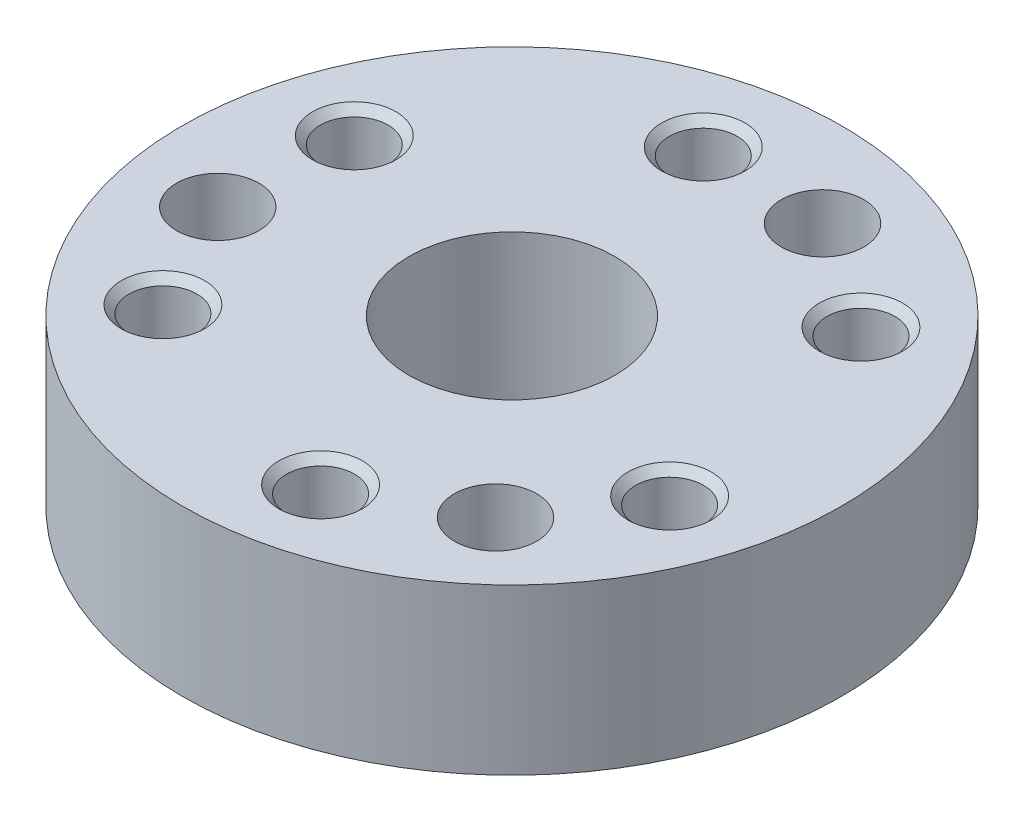
ISO-10303-21;
HEADER;
FILE_DESCRIPTION(('STEP AP214'),'2;1');
FILE_NAME('part.step','',(''),(''),'','','');
FILE_SCHEMA(('AUTOMOTIVE_DESIGN { 1 0 10303 214 1 1 1 1 }'));
ENDSEC;
DATA;
#1=APPLICATION_CONTEXT('core data for automotive mechanical design processes');
#2=APPLICATION_PROTOCOL_DEFINITION('international standard','automotive_design',2000,#1);
#3=PRODUCT_CONTEXT('',#1,'mechanical');
#4=PRODUCT('Part','Part','',(#3));
#5=PRODUCT_RELATED_PRODUCT_CATEGORY('part','',(#4));
#6=PRODUCT_DEFINITION_FORMATION('','',#4);
#7=PRODUCT_DEFINITION_CONTEXT('part definition',#1,'design');
#8=PRODUCT_DEFINITION('design','',#6,#7);
#9=PRODUCT_DEFINITION_SHAPE('','',#8);
#10=(LENGTH_UNIT() NAMED_UNIT(*) SI_UNIT(.MILLI.,.METRE.));
#11=(NAMED_UNIT(*) PLANE_ANGLE_UNIT() SI_UNIT($,.RADIAN.));
#12=(NAMED_UNIT(*) SI_UNIT($,.STERADIAN.) SOLID_ANGLE_UNIT());
#13=UNCERTAINTY_MEASURE_WITH_UNIT(LENGTH_MEASURE(1.E-05),#10,'distance_accuracy_value','');
#14=(GEOMETRIC_REPRESENTATION_CONTEXT(3) GLOBAL_UNCERTAINTY_ASSIGNED_CONTEXT((#13)) GLOBAL_UNIT_ASSIGNED_CONTEXT((#10,
#11,#12)) REPRESENTATION_CONTEXT('',''));
#15=CARTESIAN_POINT('',(0.,0.,0.));
#16=DIRECTION('',(0.,0.,1.));
#17=DIRECTION('',(1.,0.,0.));
#18=AXIS2_PLACEMENT_3D('',#15,#16,#17);
#19=CARTESIAN_POINT('',(0.,8.,0.));
#20=DIRECTION('',(0.,-1.,0.));
#21=DIRECTION('',(0.,0.,-1.));
#22=AXIS2_PLACEMENT_3D('',#19,#20,#21);
#23=CYLINDRICAL_SURFACE('',#22,16.);
#24=CARTESIAN_POINT('',(0.,8.,0.));
#25=DIRECTION('',(0.,1.,0.));
#26=DIRECTION('',(0.,0.,1.));
#27=AXIS2_PLACEMENT_3D('',#24,#25,#26);
#28=CIRCLE('',#27,16.);
#29=CARTESIAN_POINT('',(0.,8.,16.));
#30=VERTEX_POINT('',#29);
#31=EDGE_CURVE('E11',#30,#30,#28,.T.);
#32=ORIENTED_EDGE('',*,*,#31,.F.);
#33=EDGE_LOOP('',(#32));
#34=FACE_BOUND('',#33,.T.);
#35=CARTESIAN_POINT('',(0.,0.,0.));
#36=DIRECTION('',(0.,1.,0.));
#37=DIRECTION('',(0.,0.,1.));
#38=AXIS2_PLACEMENT_3D('',#35,#36,#37);
#39=CIRCLE('',#38,16.);
#40=CARTESIAN_POINT('',(0.,0.,16.));
#41=VERTEX_POINT('',#40);
#42=EDGE_CURVE('E46',#41,#41,#39,.T.);
#43=ORIENTED_EDGE('',*,*,#42,.T.);
#44=EDGE_LOOP('',(#43));
#45=FACE_BOUND('',#44,.T.);
#46=ADVANCED_FACE('F43',(#34,#45),#23,.T.);
#47=CARTESIAN_POINT('',(0.,8.,0.));
#48=DIRECTION('',(0.,1.,0.));
#49=DIRECTION('',(0.,0.,1.));
#50=AXIS2_PLACEMENT_3D('',#47,#48,#49);
#51=PLANE('',#50);
#52=CARTESIAN_POINT('',(0.,8.,0.));
#53=DIRECTION('',(0.,1.,0.));
#54=DIRECTION('',(0.,0.,1.));
#55=AXIS2_PLACEMENT_3D('',#52,#53,#54);
#56=CIRCLE('',#55,5.);
#57=CARTESIAN_POINT('',(0.,8.,5.));
#58=VERTEX_POINT('',#57);
#59=EDGE_CURVE('E447',#58,#58,#56,.T.);
#60=ORIENTED_EDGE('',*,*,#59,.F.);
#61=EDGE_LOOP('',(#60));
#62=FACE_BOUND('',#61,.T.);
#63=CARTESIAN_POINT('',(3.64691287822149,8.,-11.4324112268));
#64=DIRECTION('',(0.,1.,0.));
#65=DIRECTION('',(0.,0.,1.));
#66=AXIS2_PLACEMENT_3D('',#63,#64,#65);
#67=CIRCLE('',#66,2.);
#68=CARTESIAN_POINT('',(3.64691287822149,8.,-9.43241122679998));
#69=VERTEX_POINT('',#68);
#70=EDGE_CURVE('E429',#69,#69,#67,.T.);
#71=ORIENTED_EDGE('',*,*,#70,.F.);
#72=EDGE_LOOP('',(#71));
#73=FACE_BOUND('',#72,.T.);
#74=CARTESIAN_POINT('',(8.07730210980904,8.,8.87452481132831));
#75=DIRECTION('',(0.,1.,0.));
#76=DIRECTION('',(0.,0.,1.));
#77=AXIS2_PLACEMENT_3D('',#74,#75,#76);
#78=CIRCLE('',#77,2.0000000000003);
#79=CARTESIAN_POINT('',(8.07730210980904,8.,10.8745248113286));
#80=VERTEX_POINT('',#79);
#81=EDGE_CURVE('E442',#80,#80,#78,.T.);
#82=ORIENTED_EDGE('',*,*,#81,.F.);
#83=EDGE_LOOP('',(#82));
#84=FACE_BOUND('',#83,.T.);
#85=CARTESIAN_POINT('',(-11.7242149880296,8.,2.557886415472));
#86=DIRECTION('',(0.,1.,0.));
#87=DIRECTION('',(0.,0.,1.));
#88=AXIS2_PLACEMENT_3D('',#85,#86,#87);
#89=CIRCLE('',#88,2.00000000000069);
#90=CARTESIAN_POINT('',(-11.7242149880296,8.,4.5578864154727));
#91=VERTEX_POINT('',#90);
#92=EDGE_CURVE('E435',#91,#91,#89,.T.);
#93=ORIENTED_EDGE('',*,*,#92,.F.);
#94=EDGE_LOOP('',(#93));
#95=FACE_BOUND('',#94,.T.);
#96=CARTESIAN_POINT('',(-11.4005241824297,8.,-3.74540363189675));
#97=DIRECTION('',(0.,1.,0.));
#98=DIRECTION('',(0.,0.,1.));
#99=AXIS2_PLACEMENT_3D('',#96,#97,#98);
#100=CIRCLE('',#99,2.025);
#101=CARTESIAN_POINT('',(-11.4005241824297,8.,-1.72040363189675));
#102=VERTEX_POINT('',#101);
#103=EDGE_CURVE('E86',#102,#102,#100,.T.);
#104=ORIENTED_EDGE('',*,*,#103,.F.);
#105=EDGE_LOOP('',(#104));
#106=FACE_BOUND('',#105,.T.);
#107=CARTESIAN_POINT('',(-2.4566473985656,8.,-11.7458453743918));
#108=DIRECTION('',(0.,1.,0.));
#109=DIRECTION('',(0.,0.,1.));
#110=AXIS2_PLACEMENT_3D('',#107,#108,#109);
#111=CIRCLE('',#110,2.025);
#112=CARTESIAN_POINT('',(-2.4566473985656,8.,-9.72084537439179));
#113=VERTEX_POINT('',#112);
#114=EDGE_CURVE('E79',#113,#113,#111,.T.);
#115=ORIENTED_EDGE('',*,*,#114,.F.);
#116=EDGE_LOOP('',(#115));
#117=FACE_BOUND('',#116,.T.);
#118=CARTESIAN_POINT('',(8.94387678386458,8.,-8.00044174249514));
#119=DIRECTION('',(0.,1.,0.));
#120=DIRECTION('',(0.,0.,1.));
#121=AXIS2_PLACEMENT_3D('',#118,#119,#120);
#122=CIRCLE('',#121,2.025);
#123=CARTESIAN_POINT('',(8.94387678386458,8.,-5.97544174249513));
#124=VERTEX_POINT('',#123);
#125=EDGE_CURVE('E95',#124,#124,#122,.T.);
#126=ORIENTED_EDGE('',*,*,#125,.F.);
#127=EDGE_LOOP('',(#126));
#128=FACE_BOUND('',#127,.T.);
#129=CARTESIAN_POINT('',(11.4005241824307,8.,3.74540363189655));
#130=DIRECTION('',(0.,1.,0.));
#131=DIRECTION('',(0.,0.,1.));
#132=AXIS2_PLACEMENT_3D('',#129,#130,#131);
#133=CIRCLE('',#132,2.025);
#134=CARTESIAN_POINT('',(11.4005241824307,8.,5.77040363189655));
#135=VERTEX_POINT('',#134);
#136=EDGE_CURVE('E104',#135,#135,#133,.T.);
#137=ORIENTED_EDGE('',*,*,#136,.F.);
#138=EDGE_LOOP('',(#137));
#139=FACE_BOUND('',#138,.T.);
#140=CARTESIAN_POINT('',(2.45664739856658,8.,11.7458453743916));
#141=DIRECTION('',(0.,1.,0.));
#142=DIRECTION('',(0.,0.,1.));
#143=AXIS2_PLACEMENT_3D('',#140,#141,#142);
#144=CIRCLE('',#143,2.025);
#145=CARTESIAN_POINT('',(2.45664739856658,8.,13.7708453743916));
#146=VERTEX_POINT('',#145);
#147=EDGE_CURVE('E113',#146,#146,#144,.T.);
#148=ORIENTED_EDGE('',*,*,#147,.F.);
#149=EDGE_LOOP('',(#148));
#150=FACE_BOUND('',#149,.T.);
#151=CARTESIAN_POINT('',(-8.9438767838636,8.,8.00044174249493));
#152=DIRECTION('',(0.,1.,0.));
#153=DIRECTION('',(0.,0.,1.));
#154=AXIS2_PLACEMENT_3D('',#151,#152,#153);
#155=CIRCLE('',#154,2.025);
#156=CARTESIAN_POINT('',(-8.9438767838636,8.,10.0254417424949));
#157=VERTEX_POINT('',#156);
#158=EDGE_CURVE('E122',#157,#157,#155,.T.);
#159=ORIENTED_EDGE('',*,*,#158,.F.);
#160=EDGE_LOOP('',(#159));
#161=FACE_BOUND('',#160,.T.);
#162=ORIENTED_EDGE('',*,*,#31,.T.);
#163=EDGE_LOOP('',(#162));
#164=FACE_BOUND('',#163,.T.);
#165=ADVANCED_FACE('F139',(#62,#73,#84,#95,#106,#117,#128,#139,#150,#161,#164),#51,.T.);
#166=CARTESIAN_POINT('',(0.,0.,0.));
#167=DIRECTION('',(0.,1.,0.));
#168=DIRECTION('',(0.,0.,1.));
#169=AXIS2_PLACEMENT_3D('',#166,#167,#168);
#170=PLANE('',#169);
#171=CARTESIAN_POINT('',(0.,0.,0.));
#172=DIRECTION('',(0.,1.,0.));
#173=DIRECTION('',(0.,0.,1.));
#174=AXIS2_PLACEMENT_3D('',#171,#172,#173);
#175=CIRCLE('',#174,5.);
#176=CARTESIAN_POINT('',(0.,0.,5.));
#177=VERTEX_POINT('',#176);
#178=EDGE_CURVE('E436',#177,#177,#175,.T.);
#179=ORIENTED_EDGE('',*,*,#178,.T.);
#180=EDGE_LOOP('',(#179));
#181=FACE_BOUND('',#180,.T.);
#182=CARTESIAN_POINT('',(3.64691287822149,0.,-11.4324112268));
#183=DIRECTION('',(0.,1.,0.));
#184=DIRECTION('',(0.,0.,1.));
#185=AXIS2_PLACEMENT_3D('',#182,#183,#184);
#186=CIRCLE('',#185,2.);
#187=CARTESIAN_POINT('',(3.64691287822149,0.,-9.43241122679998));
#188=VERTEX_POINT('',#187);
#189=EDGE_CURVE('E427',#188,#188,#186,.T.);
#190=ORIENTED_EDGE('',*,*,#189,.T.);
#191=EDGE_LOOP('',(#190));
#192=FACE_BOUND('',#191,.T.);
#193=CARTESIAN_POINT('',(8.07730210980904,0.,8.87452481132831));
#194=DIRECTION('',(0.,1.,0.));
#195=DIRECTION('',(0.,0.,1.));
#196=AXIS2_PLACEMENT_3D('',#193,#194,#195);
#197=CIRCLE('',#196,2.0000000000003);
#198=CARTESIAN_POINT('',(8.07730210980904,0.,10.8745248113286));
#199=VERTEX_POINT('',#198);
#200=EDGE_CURVE('E439',#199,#199,#197,.T.);
#201=ORIENTED_EDGE('',*,*,#200,.T.);
#202=EDGE_LOOP('',(#201));
#203=FACE_BOUND('',#202,.T.);
#204=CARTESIAN_POINT('',(-11.7242149880296,0.,2.557886415472));
#205=DIRECTION('',(0.,1.,0.));
#206=DIRECTION('',(0.,0.,1.));
#207=AXIS2_PLACEMENT_3D('',#204,#205,#206);
#208=CIRCLE('',#207,2.00000000000069);
#209=CARTESIAN_POINT('',(-11.7242149880296,0.,4.5578864154727));
#210=VERTEX_POINT('',#209);
#211=EDGE_CURVE('E432',#210,#210,#208,.T.);
#212=ORIENTED_EDGE('',*,*,#211,.T.);
#213=EDGE_LOOP('',(#212));
#214=FACE_BOUND('',#213,.T.);
#215=ORIENTED_EDGE('',*,*,#42,.F.);
#216=EDGE_LOOP('',(#215));
#217=FACE_BOUND('',#216,.T.);
#218=ADVANCED_FACE('F136',(#181,#192,#203,#214,#217),#170,.F.);
#219=CARTESIAN_POINT('',(-8.9438767838636,2.,8.00044174249493));
#220=DIRECTION('',(0.,1.,0.));
#221=DIRECTION('',(0.,0.,1.));
#222=AXIS2_PLACEMENT_3D('',#219,#220,#221);
#223=CONICAL_SURFACE('',#222,1.65,1.02974425867665);
#224=CARTESIAN_POINT('',(-8.9438767838636,1.00857997860453,8.00044174249493));
#225=VERTEX_POINT('',#224);
#226=VERTEX_LOOP('',#225);
#227=FACE_BOUND('',#226,.T.);
#228=CARTESIAN_POINT('',(-8.9438767838636,2.,8.00044174249493));
#229=DIRECTION('',(0.,1.,0.));
#230=DIRECTION('',(0.,0.,1.));
#231=AXIS2_PLACEMENT_3D('',#228,#229,#230);
#232=CIRCLE('',#231,1.65);
#233=CARTESIAN_POINT('',(-8.9438767838636,2.,9.65044174249493));
#234=VERTEX_POINT('',#233);
#235=EDGE_CURVE('E128',#234,#234,#232,.T.);
#236=ORIENTED_EDGE('',*,*,#235,.T.);
#237=EDGE_LOOP('',(#236));
#238=FACE_BOUND('',#237,.T.);
#239=ADVANCED_FACE('F138',(#227,#238),#223,.F.);
#240=CARTESIAN_POINT('',(-8.9438767838636,8.,8.00044174249493));
#241=DIRECTION('',(0.,1.,0.));
#242=DIRECTION('',(0.,0.,1.));
#243=AXIS2_PLACEMENT_3D('',#240,#241,#242);
#244=CYLINDRICAL_SURFACE('',#243,1.65);
#245=ORIENTED_EDGE('',*,*,#235,.F.);
#246=EDGE_LOOP('',(#245));
#247=FACE_BOUND('',#246,.T.);
#248=CARTESIAN_POINT('',(-8.9438767838636,7.625,8.00044174249493));
#249=DIRECTION('',(0.,1.,0.));
#250=DIRECTION('',(0.,0.,1.));
#251=AXIS2_PLACEMENT_3D('',#248,#249,#250);
#252=CIRCLE('',#251,1.65);
#253=CARTESIAN_POINT('',(-8.9438767838636,7.625,9.65044174249493));
#254=VERTEX_POINT('',#253);
#255=EDGE_CURVE('E125',#254,#254,#252,.T.);
#256=ORIENTED_EDGE('',*,*,#255,.T.);
#257=EDGE_LOOP('',(#256));
#258=FACE_BOUND('',#257,.T.);
#259=ADVANCED_FACE('F145',(#247,#258),#244,.F.);
#260=CARTESIAN_POINT('',(-8.9438767838636,8.,8.00044174249493));
#261=DIRECTION('',(0.,1.,0.));
#262=DIRECTION('',(0.,0.,1.));
#263=AXIS2_PLACEMENT_3D('',#260,#261,#262);
#264=CONICAL_SURFACE('',#263,2.025,0.785398163397445);
#265=ORIENTED_EDGE('',*,*,#255,.F.);
#266=EDGE_LOOP('',(#265));
#267=FACE_BOUND('',#266,.T.);
#268=ORIENTED_EDGE('',*,*,#158,.T.);
#269=EDGE_LOOP('',(#268));
#270=FACE_BOUND('',#269,.T.);
#271=ADVANCED_FACE('F316',(#267,#270),#264,.F.);
#272=CARTESIAN_POINT('',(2.45664739856658,2.,11.7458453743916));
#273=DIRECTION('',(0.,1.,0.));
#274=DIRECTION('',(0.,0.,1.));
#275=AXIS2_PLACEMENT_3D('',#272,#273,#274);
#276=CONICAL_SURFACE('',#275,1.65,1.02974425867665);
#277=CARTESIAN_POINT('',(2.45664739856658,1.00857997860453,11.7458453743916));
#278=VERTEX_POINT('',#277);
#279=VERTEX_LOOP('',#278);
#280=FACE_BOUND('',#279,.T.);
#281=CARTESIAN_POINT('',(2.45664739856658,2.,11.7458453743916));
#282=DIRECTION('',(0.,1.,0.));
#283=DIRECTION('',(0.,0.,1.));
#284=AXIS2_PLACEMENT_3D('',#281,#282,#283);
#285=CIRCLE('',#284,1.65);
#286=CARTESIAN_POINT('',(2.45664739856658,2.,13.3958453743916));
#287=VERTEX_POINT('',#286);
#288=EDGE_CURVE('E119',#287,#287,#285,.T.);
#289=ORIENTED_EDGE('',*,*,#288,.T.);
#290=EDGE_LOOP('',(#289));
#291=FACE_BOUND('',#290,.T.);
#292=ADVANCED_FACE('F308',(#280,#291),#276,.F.);
#293=CARTESIAN_POINT('',(2.45664739856658,8.,11.7458453743916));
#294=DIRECTION('',(0.,1.,0.));
#295=DIRECTION('',(0.,0.,1.));
#296=AXIS2_PLACEMENT_3D('',#293,#294,#295);
#297=CYLINDRICAL_SURFACE('',#296,1.65);
#298=ORIENTED_EDGE('',*,*,#288,.F.);
#299=EDGE_LOOP('',(#298));
#300=FACE_BOUND('',#299,.T.);
#301=CARTESIAN_POINT('',(2.45664739856658,7.625,11.7458453743916));
#302=DIRECTION('',(0.,1.,0.));
#303=DIRECTION('',(0.,0.,1.));
#304=AXIS2_PLACEMENT_3D('',#301,#302,#303);
#305=CIRCLE('',#304,1.65);
#306=CARTESIAN_POINT('',(2.45664739856658,7.625,13.3958453743916));
#307=VERTEX_POINT('',#306);
#308=EDGE_CURVE('E116',#307,#307,#305,.T.);
#309=ORIENTED_EDGE('',*,*,#308,.T.);
#310=EDGE_LOOP('',(#309));
#311=FACE_BOUND('',#310,.T.);
#312=ADVANCED_FACE('F300',(#300,#311),#297,.F.);
#313=CARTESIAN_POINT('',(2.45664739856658,8.,11.7458453743916));
#314=DIRECTION('',(0.,1.,0.));
#315=DIRECTION('',(0.,0.,1.));
#316=AXIS2_PLACEMENT_3D('',#313,#314,#315);
#317=CONICAL_SURFACE('',#316,2.025,0.785398163397445);
#318=ORIENTED_EDGE('',*,*,#308,.F.);
#319=EDGE_LOOP('',(#318));
#320=FACE_BOUND('',#319,.T.);
#321=ORIENTED_EDGE('',*,*,#147,.T.);
#322=EDGE_LOOP('',(#321));
#323=FACE_BOUND('',#322,.T.);
#324=ADVANCED_FACE('F292',(#320,#323),#317,.F.);
#325=CARTESIAN_POINT('',(11.4005241824307,2.,3.74540363189655));
#326=DIRECTION('',(0.,1.,0.));
#327=DIRECTION('',(0.,0.,1.));
#328=AXIS2_PLACEMENT_3D('',#325,#326,#327);
#329=CONICAL_SURFACE('',#328,1.65,1.02974425867665);
#330=CARTESIAN_POINT('',(11.4005241824307,1.00857997860453,3.74540363189655));
#331=VERTEX_POINT('',#330);
#332=VERTEX_LOOP('',#331);
#333=FACE_BOUND('',#332,.T.);
#334=CARTESIAN_POINT('',(11.4005241824307,2.,3.74540363189655));
#335=DIRECTION('',(0.,1.,0.));
#336=DIRECTION('',(0.,0.,1.));
#337=AXIS2_PLACEMENT_3D('',#334,#335,#336);
#338=CIRCLE('',#337,1.65);
#339=CARTESIAN_POINT('',(11.4005241824307,2.,5.39540363189654));
#340=VERTEX_POINT('',#339);
#341=EDGE_CURVE('E110',#340,#340,#338,.T.);
#342=ORIENTED_EDGE('',*,*,#341,.T.);
#343=EDGE_LOOP('',(#342));
#344=FACE_BOUND('',#343,.T.);
#345=ADVANCED_FACE('F284',(#333,#344),#329,.F.);
#346=CARTESIAN_POINT('',(11.4005241824307,8.,3.74540363189655));
#347=DIRECTION('',(0.,1.,0.));
#348=DIRECTION('',(0.,0.,1.));
#349=AXIS2_PLACEMENT_3D('',#346,#347,#348);
#350=CYLINDRICAL_SURFACE('',#349,1.65);
#351=ORIENTED_EDGE('',*,*,#341,.F.);
#352=EDGE_LOOP('',(#351));
#353=FACE_BOUND('',#352,.T.);
#354=CARTESIAN_POINT('',(11.4005241824307,7.625,3.74540363189655));
#355=DIRECTION('',(0.,1.,0.));
#356=DIRECTION('',(0.,0.,1.));
#357=AXIS2_PLACEMENT_3D('',#354,#355,#356);
#358=CIRCLE('',#357,1.65);
#359=CARTESIAN_POINT('',(11.4005241824307,7.625,5.39540363189655));
#360=VERTEX_POINT('',#359);
#361=EDGE_CURVE('E107',#360,#360,#358,.T.);
#362=ORIENTED_EDGE('',*,*,#361,.T.);
#363=EDGE_LOOP('',(#362));
#364=FACE_BOUND('',#363,.T.);
#365=ADVANCED_FACE('F276',(#353,#364),#350,.F.);
#366=CARTESIAN_POINT('',(11.4005241824307,8.,3.74540363189655));
#367=DIRECTION('',(0.,1.,0.));
#368=DIRECTION('',(0.,0.,1.));
#369=AXIS2_PLACEMENT_3D('',#366,#367,#368);
#370=CONICAL_SURFACE('',#369,2.025,0.785398163397446);
#371=ORIENTED_EDGE('',*,*,#361,.F.);
#372=EDGE_LOOP('',(#371));
#373=FACE_BOUND('',#372,.T.);
#374=ORIENTED_EDGE('',*,*,#136,.T.);
#375=EDGE_LOOP('',(#374));
#376=FACE_BOUND('',#375,.T.);
#377=ADVANCED_FACE('F268',(#373,#376),#370,.F.);
#378=CARTESIAN_POINT('',(8.94387678386458,2.,-8.00044174249514));
#379=DIRECTION('',(0.,1.,0.));
#380=DIRECTION('',(0.,0.,1.));
#381=AXIS2_PLACEMENT_3D('',#378,#379,#380);
#382=CONICAL_SURFACE('',#381,1.65,1.02974425867665);
#383=CARTESIAN_POINT('',(8.94387678386458,1.00857997860453,-8.00044174249514));
#384=VERTEX_POINT('',#383);
#385=VERTEX_LOOP('',#384);
#386=FACE_BOUND('',#385,.T.);
#387=CARTESIAN_POINT('',(8.94387678386458,2.,-8.00044174249514));
#388=DIRECTION('',(0.,1.,0.));
#389=DIRECTION('',(0.,0.,1.));
#390=AXIS2_PLACEMENT_3D('',#387,#388,#389);
#391=CIRCLE('',#390,1.65);
#392=CARTESIAN_POINT('',(8.94387678386458,2.,-6.35044174249514));
#393=VERTEX_POINT('',#392);
#394=EDGE_CURVE('E101',#393,#393,#391,.T.);
#395=ORIENTED_EDGE('',*,*,#394,.T.);
#396=EDGE_LOOP('',(#395));
#397=FACE_BOUND('',#396,.T.);
#398=ADVANCED_FACE('F260',(#386,#397),#382,.F.);
#399=CARTESIAN_POINT('',(8.94387678386458,8.,-8.00044174249514));
#400=DIRECTION('',(0.,1.,0.));
#401=DIRECTION('',(0.,0.,1.));
#402=AXIS2_PLACEMENT_3D('',#399,#400,#401);
#403=CYLINDRICAL_SURFACE('',#402,1.65);
#404=ORIENTED_EDGE('',*,*,#394,.F.);
#405=EDGE_LOOP('',(#404));
#406=FACE_BOUND('',#405,.T.);
#407=CARTESIAN_POINT('',(8.94387678386458,7.625,-8.00044174249514));
#408=DIRECTION('',(0.,1.,0.));
#409=DIRECTION('',(0.,0.,1.));
#410=AXIS2_PLACEMENT_3D('',#407,#408,#409);
#411=CIRCLE('',#410,1.65);
#412=CARTESIAN_POINT('',(8.94387678386458,7.625,-6.35044174249514));
#413=VERTEX_POINT('',#412);
#414=EDGE_CURVE('E98',#413,#413,#411,.T.);
#415=ORIENTED_EDGE('',*,*,#414,.T.);
#416=EDGE_LOOP('',(#415));
#417=FACE_BOUND('',#416,.T.);
#418=ADVANCED_FACE('F252',(#406,#417),#403,.F.);
#419=CARTESIAN_POINT('',(8.94387678386458,8.,-8.00044174249514));
#420=DIRECTION('',(0.,1.,0.));
#421=DIRECTION('',(0.,0.,1.));
#422=AXIS2_PLACEMENT_3D('',#419,#420,#421);
#423=CONICAL_SURFACE('',#422,2.025,0.785398163397446);
#424=ORIENTED_EDGE('',*,*,#414,.F.);
#425=EDGE_LOOP('',(#424));
#426=FACE_BOUND('',#425,.T.);
#427=ORIENTED_EDGE('',*,*,#125,.T.);
#428=EDGE_LOOP('',(#427));
#429=FACE_BOUND('',#428,.T.);
#430=ADVANCED_FACE('F244',(#426,#429),#423,.F.);
#431=CARTESIAN_POINT('',(-2.4566473985656,2.,-11.7458453743918));
#432=DIRECTION('',(0.,1.,0.));
#433=DIRECTION('',(0.,0.,1.));
#434=AXIS2_PLACEMENT_3D('',#431,#432,#433);
#435=CONICAL_SURFACE('',#434,1.65,1.02974425867665);
#436=CARTESIAN_POINT('',(-2.4566473985656,1.00857997860453,-11.7458453743918));
#437=VERTEX_POINT('',#436);
#438=VERTEX_LOOP('',#437);
#439=FACE_BOUND('',#438,.T.);
#440=CARTESIAN_POINT('',(-2.4566473985656,2.,-11.7458453743918));
#441=DIRECTION('',(0.,1.,0.));
#442=DIRECTION('',(0.,0.,1.));
#443=AXIS2_PLACEMENT_3D('',#440,#441,#442);
#444=CIRCLE('',#443,1.65);
#445=CARTESIAN_POINT('',(-2.4566473985656,2.,-10.0958453743918));
#446=VERTEX_POINT('',#445);
#447=EDGE_CURVE('E92',#446,#446,#444,.T.);
#448=ORIENTED_EDGE('',*,*,#447,.T.);
#449=EDGE_LOOP('',(#448));
#450=FACE_BOUND('',#449,.T.);
#451=ADVANCED_FACE('F236',(#439,#450),#435,.F.);
#452=CARTESIAN_POINT('',(-2.4566473985656,8.,-11.7458453743918));
#453=DIRECTION('',(0.,1.,0.));
#454=DIRECTION('',(0.,0.,1.));
#455=AXIS2_PLACEMENT_3D('',#452,#453,#454);
#456=CYLINDRICAL_SURFACE('',#455,1.65);
#457=ORIENTED_EDGE('',*,*,#447,.F.);
#458=EDGE_LOOP('',(#457));
#459=FACE_BOUND('',#458,.T.);
#460=CARTESIAN_POINT('',(-2.4566473985656,7.625,-11.7458453743918));
#461=DIRECTION('',(0.,1.,0.));
#462=DIRECTION('',(0.,0.,1.));
#463=AXIS2_PLACEMENT_3D('',#460,#461,#462);
#464=CIRCLE('',#463,1.65);
#465=CARTESIAN_POINT('',(-2.4566473985656,7.625,-10.0958453743918));
#466=VERTEX_POINT('',#465);
#467=EDGE_CURVE('E83',#466,#466,#464,.T.);
#468=ORIENTED_EDGE('',*,*,#467,.T.);
#469=EDGE_LOOP('',(#468));
#470=FACE_BOUND('',#469,.T.);
#471=ADVANCED_FACE('F228',(#459,#470),#456,.F.);
#472=CARTESIAN_POINT('',(-2.4566473985656,8.,-11.7458453743918));
#473=DIRECTION('',(0.,1.,0.));
#474=DIRECTION('',(0.,0.,1.));
#475=AXIS2_PLACEMENT_3D('',#472,#473,#474);
#476=CONICAL_SURFACE('',#475,2.025,0.785398163397445);
#477=ORIENTED_EDGE('',*,*,#467,.F.);
#478=EDGE_LOOP('',(#477));
#479=FACE_BOUND('',#478,.T.);
#480=ORIENTED_EDGE('',*,*,#114,.T.);
#481=EDGE_LOOP('',(#480));
#482=FACE_BOUND('',#481,.T.);
#483=ADVANCED_FACE('F73',(#479,#482),#476,.F.);
#484=CARTESIAN_POINT('',(-11.4005241824297,2.,-3.74540363189675));
#485=DIRECTION('',(0.,1.,0.));
#486=DIRECTION('',(0.,0.,1.));
#487=AXIS2_PLACEMENT_3D('',#484,#485,#486);
#488=CONICAL_SURFACE('',#487,1.65,1.02974425867665);
#489=CARTESIAN_POINT('',(-11.4005241824297,1.00857997860453,-3.74540363189675));
#490=VERTEX_POINT('',#489);
#491=VERTEX_LOOP('',#490);
#492=FACE_BOUND('',#491,.T.);
#493=CARTESIAN_POINT('',(-11.4005241824297,2.,-3.74540363189675));
#494=DIRECTION('',(0.,1.,0.));
#495=DIRECTION('',(0.,0.,1.));
#496=AXIS2_PLACEMENT_3D('',#493,#494,#495);
#497=CIRCLE('',#496,1.65);
#498=CARTESIAN_POINT('',(-11.4005241824297,2.,-2.09540363189675));
#499=VERTEX_POINT('',#498);
#500=EDGE_CURVE('E77',#499,#499,#497,.T.);
#501=ORIENTED_EDGE('',*,*,#500,.T.);
#502=EDGE_LOOP('',(#501));
#503=FACE_BOUND('',#502,.T.);
#504=ADVANCED_FACE('F69',(#492,#503),#488,.F.);
#505=CARTESIAN_POINT('',(-11.4005241824297,8.,-3.74540363189675));
#506=DIRECTION('',(0.,1.,0.));
#507=DIRECTION('',(0.,0.,1.));
#508=AXIS2_PLACEMENT_3D('',#505,#506,#507);
#509=CYLINDRICAL_SURFACE('',#508,1.65);
#510=ORIENTED_EDGE('',*,*,#500,.F.);
#511=EDGE_LOOP('',(#510));
#512=FACE_BOUND('',#511,.T.);
#513=CARTESIAN_POINT('',(-11.4005241824297,7.625,-3.74540363189675));
#514=DIRECTION('',(0.,1.,0.));
#515=DIRECTION('',(0.,0.,1.));
#516=AXIS2_PLACEMENT_3D('',#513,#514,#515);
#517=CIRCLE('',#516,1.65);
#518=CARTESIAN_POINT('',(-11.4005241824297,7.625,-2.09540363189675));
#519=VERTEX_POINT('',#518);
#520=EDGE_CURVE('E80',#519,#519,#517,.T.);
#521=ORIENTED_EDGE('',*,*,#520,.T.);
#522=EDGE_LOOP('',(#521));
#523=FACE_BOUND('',#522,.T.);
#524=ADVANCED_FACE('F72',(#512,#523),#509,.F.);
#525=CARTESIAN_POINT('',(-11.4005241824297,8.,-3.74540363189675));
#526=DIRECTION('',(0.,1.,0.));
#527=DIRECTION('',(0.,0.,1.));
#528=AXIS2_PLACEMENT_3D('',#525,#526,#527);
#529=CONICAL_SURFACE('',#528,2.025,0.785398163397446);
#530=ORIENTED_EDGE('',*,*,#520,.F.);
#531=EDGE_LOOP('',(#530));
#532=FACE_BOUND('',#531,.T.);
#533=ORIENTED_EDGE('',*,*,#103,.T.);
#534=EDGE_LOOP('',(#533));
#535=FACE_BOUND('',#534,.T.);
#536=ADVANCED_FACE('F202',(#532,#535),#529,.F.);
#537=CARTESIAN_POINT('',(-11.7242149880296,0.,2.557886415472));
#538=DIRECTION('',(0.,1.,0.));
#539=DIRECTION('',(0.,0.,1.));
#540=AXIS2_PLACEMENT_3D('',#537,#538,#539);
#541=CYLINDRICAL_SURFACE('',#540,2.00000000000069);
#542=ORIENTED_EDGE('',*,*,#211,.F.);
#543=EDGE_LOOP('',(#542));
#544=FACE_BOUND('',#543,.T.);
#545=ORIENTED_EDGE('',*,*,#92,.T.);
#546=EDGE_LOOP('',(#545));
#547=FACE_BOUND('',#546,.T.);
#548=ADVANCED_FACE('F194',(#544,#547),#541,.F.);
#549=CARTESIAN_POINT('',(8.07730210980904,0.,8.87452481132831));
#550=DIRECTION('',(0.,1.,0.));
#551=DIRECTION('',(0.,0.,1.));
#552=AXIS2_PLACEMENT_3D('',#549,#550,#551);
#553=CYLINDRICAL_SURFACE('',#552,2.0000000000003);
#554=ORIENTED_EDGE('',*,*,#200,.F.);
#555=EDGE_LOOP('',(#554));
#556=FACE_BOUND('',#555,.T.);
#557=ORIENTED_EDGE('',*,*,#81,.T.);
#558=EDGE_LOOP('',(#557));
#559=FACE_BOUND('',#558,.T.);
#560=ADVANCED_FACE('F189',(#556,#559),#553,.F.);
#561=CARTESIAN_POINT('',(3.64691287822149,0.,-11.4324112268));
#562=DIRECTION('',(0.,1.,0.));
#563=DIRECTION('',(0.,0.,1.));
#564=AXIS2_PLACEMENT_3D('',#561,#562,#563);
#565=CYLINDRICAL_SURFACE('',#564,2.);
#566=ORIENTED_EDGE('',*,*,#189,.F.);
#567=EDGE_LOOP('',(#566));
#568=FACE_BOUND('',#567,.T.);
#569=ORIENTED_EDGE('',*,*,#70,.T.);
#570=EDGE_LOOP('',(#569));
#571=FACE_BOUND('',#570,.T.);
#572=ADVANCED_FACE('F168',(#568,#571),#565,.F.);
#573=CARTESIAN_POINT('',(0.,0.,0.));
#574=DIRECTION('',(0.,1.,0.));
#575=DIRECTION('',(0.,0.,1.));
#576=AXIS2_PLACEMENT_3D('',#573,#574,#575);
#577=CYLINDRICAL_SURFACE('',#576,5.);
#578=ORIENTED_EDGE('',*,*,#178,.F.);
#579=EDGE_LOOP('',(#578));
#580=FACE_BOUND('',#579,.T.);
#581=ORIENTED_EDGE('',*,*,#59,.T.);
#582=EDGE_LOOP('',(#581));
#583=FACE_BOUND('',#582,.T.);
#584=ADVANCED_FACE('F178',(#580,#583),#577,.F.);
#585=CLOSED_SHELL('',(#46,#165,#218,#239,#259,#271,#292,#312,#324,#345,#365,#377,#398,#418,#430,
#451,#471,#483,#504,#524,#536,#548,#560,#572,#584));
#586=MANIFOLD_SOLID_BREP('B2',#585);
#587=ADVANCED_BREP_SHAPE_REPRESENTATION('',(#18,#586),#14);
#588=SHAPE_DEFINITION_REPRESENTATION(#9,#587);
ENDSEC;
END-ISO-10303-21;
